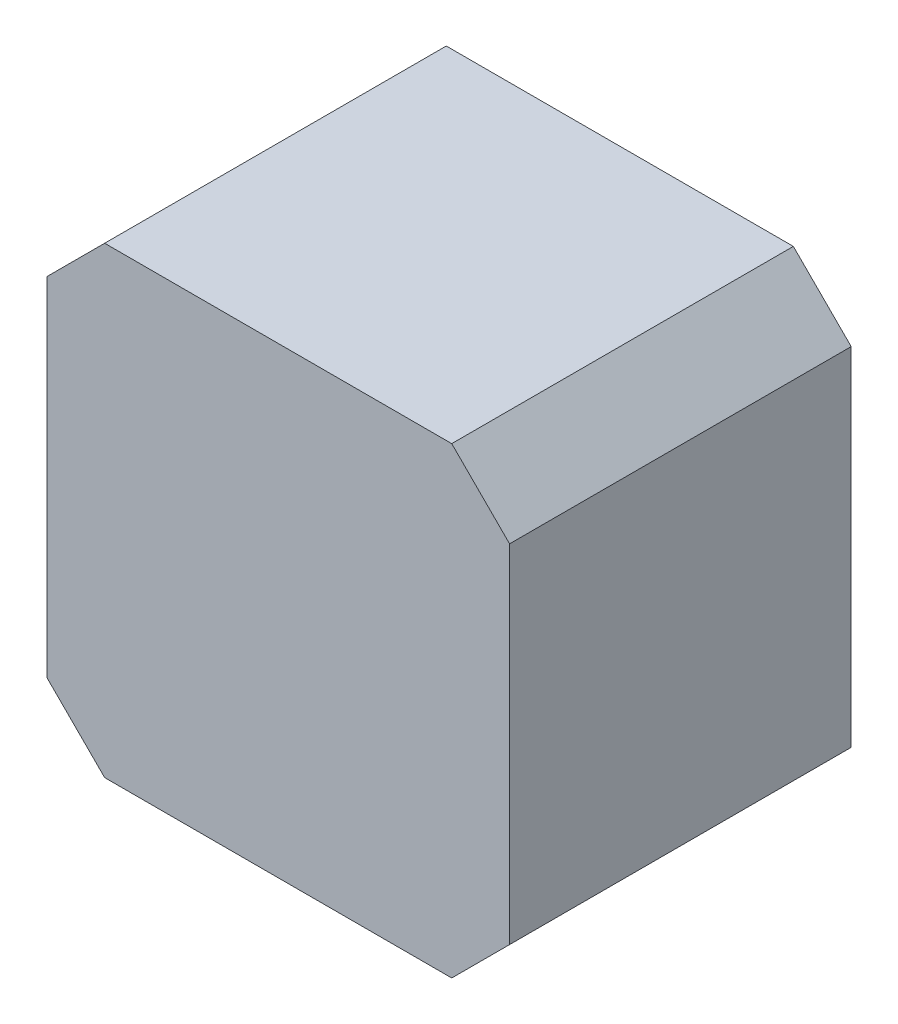
ISO-10303-21;
HEADER;
FILE_DESCRIPTION(('STEP AP214'),'2;1');
FILE_NAME('part.step','',(''),(''),'','','');
FILE_SCHEMA(('AUTOMOTIVE_DESIGN { 1 0 10303 214 1 1 1 1 }'));
ENDSEC;
DATA;
#1=APPLICATION_CONTEXT('core data for automotive mechanical design processes');
#2=APPLICATION_PROTOCOL_DEFINITION('international standard','automotive_design',2000,#1);
#3=PRODUCT_CONTEXT('',#1,'mechanical');
#4=PRODUCT('Part','Part','',(#3));
#5=PRODUCT_RELATED_PRODUCT_CATEGORY('part','',(#4));
#6=PRODUCT_DEFINITION_FORMATION('','',#4);
#7=PRODUCT_DEFINITION_CONTEXT('part definition',#1,'design');
#8=PRODUCT_DEFINITION('design','',#6,#7);
#9=PRODUCT_DEFINITION_SHAPE('','',#8);
#10=(LENGTH_UNIT() NAMED_UNIT(*) SI_UNIT(.MILLI.,.METRE.));
#11=(NAMED_UNIT(*) PLANE_ANGLE_UNIT() SI_UNIT($,.RADIAN.));
#12=(NAMED_UNIT(*) SI_UNIT($,.STERADIAN.) SOLID_ANGLE_UNIT());
#13=UNCERTAINTY_MEASURE_WITH_UNIT(LENGTH_MEASURE(1.E-05),#10,'distance_accuracy_value','');
#14=(GEOMETRIC_REPRESENTATION_CONTEXT(3) GLOBAL_UNCERTAINTY_ASSIGNED_CONTEXT((#13)) GLOBAL_UNIT_ASSIGNED_CONTEXT((#10,
#11,#12)) REPRESENTATION_CONTEXT('',''));
#15=CARTESIAN_POINT('',(0.,0.,0.));
#16=DIRECTION('',(0.,0.,1.));
#17=DIRECTION('',(1.,0.,0.));
#18=AXIS2_PLACEMENT_3D('',#15,#16,#17);
#19=CARTESIAN_POINT('',(1.016,-0.762,0.));
#20=DIRECTION('',(0.707106781186548,-0.707106781186548,0.));
#21=DIRECTION('',(0.707106781186548,0.707106781186548,0.));
#22=AXIS2_PLACEMENT_3D('',#19,#20,#21);
#23=PLANE('',#22);
#24=DIRECTION('',(0.,0.,-1.));
#25=VECTOR('',#24,1.);
#26=CARTESIAN_POINT('',(0.762,-1.016,0.));
#27=LINE('',#26,#25);
#28=CARTESIAN_POINT('',(0.762,-1.016,0.));
#29=VERTEX_POINT('',#28);
#30=CARTESIAN_POINT('',(0.762,-1.016,1.5));
#31=VERTEX_POINT('',#30);
#32=EDGE_CURVE('E86',#29,#31,#27,.F.);
#33=ORIENTED_EDGE('',*,*,#32,.F.);
#34=DIRECTION('',(0.707106781186548,0.707106781186548,0.));
#35=VECTOR('',#34,1.);
#36=CARTESIAN_POINT('',(1.016,-0.762,0.));
#37=LINE('',#36,#35);
#38=CARTESIAN_POINT('',(1.016,-0.762,0.));
#39=VERTEX_POINT('',#38);
#40=EDGE_CURVE('E20',#29,#39,#37,.T.);
#41=ORIENTED_EDGE('',*,*,#40,.T.);
#42=DIRECTION('',(0.,0.,-1.));
#43=VECTOR('',#42,1.);
#44=CARTESIAN_POINT('',(1.016,-0.762,0.));
#45=LINE('',#44,#43);
#46=CARTESIAN_POINT('',(1.016,-0.762,1.5));
#47=VERTEX_POINT('',#46);
#48=EDGE_CURVE('E99',#47,#39,#45,.T.);
#49=ORIENTED_EDGE('',*,*,#48,.F.);
#50=DIRECTION('',(0.707106781186547,0.707106781186548,0.));
#51=VECTOR('',#50,1.);
#52=CARTESIAN_POINT('',(0.762,-1.016,1.5));
#53=LINE('',#52,#51);
#54=EDGE_CURVE('E97',#31,#47,#53,.T.);
#55=ORIENTED_EDGE('',*,*,#54,.F.);
#56=EDGE_LOOP('',(#33,#41,#49,#55));
#57=FACE_BOUND('',#56,.T.);
#58=ADVANCED_FACE('F17',(#57),#23,.T.);
#59=CARTESIAN_POINT('',(0.762,1.016,0.));
#60=DIRECTION('',(0.707106781186548,0.707106781186548,0.));
#61=DIRECTION('',(-0.707106781186548,0.707106781186548,0.));
#62=AXIS2_PLACEMENT_3D('',#59,#60,#61);
#63=PLANE('',#62);
#64=DIRECTION('',(0.,0.,-1.));
#65=VECTOR('',#64,1.);
#66=CARTESIAN_POINT('',(1.016,0.762,0.));
#67=LINE('',#66,#65);
#68=CARTESIAN_POINT('',(1.016,0.762,0.));
#69=VERTEX_POINT('',#68);
#70=CARTESIAN_POINT('',(1.016,0.762,1.5));
#71=VERTEX_POINT('',#70);
#72=EDGE_CURVE('E108',#69,#71,#67,.F.);
#73=ORIENTED_EDGE('',*,*,#72,.F.);
#74=DIRECTION('',(-0.707106781186548,0.707106781186548,0.));
#75=VECTOR('',#74,1.);
#76=CARTESIAN_POINT('',(0.762,1.016,0.));
#77=LINE('',#76,#75);
#78=CARTESIAN_POINT('',(0.762,1.016,0.));
#79=VERTEX_POINT('',#78);
#80=EDGE_CURVE('E118',#69,#79,#77,.T.);
#81=ORIENTED_EDGE('',*,*,#80,.T.);
#82=DIRECTION('',(0.,0.,1.));
#83=VECTOR('',#82,1.);
#84=CARTESIAN_POINT('',(0.762,1.016,0.));
#85=LINE('',#84,#83);
#86=CARTESIAN_POINT('',(0.762,1.016,1.5));
#87=VERTEX_POINT('',#86);
#88=EDGE_CURVE('E145',#87,#79,#85,.F.);
#89=ORIENTED_EDGE('',*,*,#88,.F.);
#90=DIRECTION('',(-0.707106781186547,0.707106781186548,0.));
#91=VECTOR('',#90,1.);
#92=CARTESIAN_POINT('',(1.016,0.762,1.5));
#93=LINE('',#92,#91);
#94=EDGE_CURVE('E102',#71,#87,#93,.T.);
#95=ORIENTED_EDGE('',*,*,#94,.F.);
#96=EDGE_LOOP('',(#73,#81,#89,#95));
#97=FACE_BOUND('',#96,.T.);
#98=ADVANCED_FACE('F153',(#97),#63,.T.);
#99=CARTESIAN_POINT('',(-0.762,-1.016,0.));
#100=DIRECTION('',(-0.707106781186548,-0.707106781186548,0.));
#101=DIRECTION('',(0.707106781186548,-0.707106781186548,0.));
#102=AXIS2_PLACEMENT_3D('',#99,#100,#101);
#103=PLANE('',#102);
#104=DIRECTION('',(0.,0.,1.));
#105=VECTOR('',#104,1.);
#106=CARTESIAN_POINT('',(-1.016,-0.762,0.));
#107=LINE('',#106,#105);
#108=CARTESIAN_POINT('',(-1.016,-0.762,0.));
#109=VERTEX_POINT('',#108);
#110=CARTESIAN_POINT('',(-1.016,-0.762,1.5));
#111=VERTEX_POINT('',#110);
#112=EDGE_CURVE('E143',#109,#111,#107,.T.);
#113=ORIENTED_EDGE('',*,*,#112,.F.);
#114=DIRECTION('',(0.707106781186548,-0.707106781186548,0.));
#115=VECTOR('',#114,1.);
#116=CARTESIAN_POINT('',(-0.762,-1.016,0.));
#117=LINE('',#116,#115);
#118=CARTESIAN_POINT('',(-0.762,-1.016,0.));
#119=VERTEX_POINT('',#118);
#120=EDGE_CURVE('E117',#109,#119,#117,.T.);
#121=ORIENTED_EDGE('',*,*,#120,.T.);
#122=DIRECTION('',(0.,0.,-1.));
#123=VECTOR('',#122,1.);
#124=CARTESIAN_POINT('',(-0.762,-1.016,0.));
#125=LINE('',#124,#123);
#126=CARTESIAN_POINT('',(-0.762,-1.016,1.5));
#127=VERTEX_POINT('',#126);
#128=EDGE_CURVE('E106',#127,#119,#125,.T.);
#129=ORIENTED_EDGE('',*,*,#128,.F.);
#130=DIRECTION('',(0.707106781186548,-0.707106781186548,0.));
#131=VECTOR('',#130,1.);
#132=CARTESIAN_POINT('',(-1.016,-0.762,1.5));
#133=LINE('',#132,#131);
#134=EDGE_CURVE('E80',#111,#127,#133,.T.);
#135=ORIENTED_EDGE('',*,*,#134,.F.);
#136=EDGE_LOOP('',(#113,#121,#129,#135));
#137=FACE_BOUND('',#136,.T.);
#138=ADVANCED_FACE('F163',(#137),#103,.T.);
#139=CARTESIAN_POINT('',(-1.016,-0.762,1.5));
#140=DIRECTION('',(0.,0.,1.));
#141=DIRECTION('',(1.,0.,0.));
#142=AXIS2_PLACEMENT_3D('',#139,#140,#141);
#143=PLANE('',#142);
#144=DIRECTION('',(-0.707106781186548,-0.707106781186548,0.));
#145=VECTOR('',#144,1.);
#146=CARTESIAN_POINT('',(-1.016,0.762,1.5));
#147=LINE('',#146,#145);
#148=CARTESIAN_POINT('',(-1.016,0.762,1.5));
#149=VERTEX_POINT('',#148);
#150=CARTESIAN_POINT('',(-0.762,1.016,1.5));
#151=VERTEX_POINT('',#150);
#152=EDGE_CURVE('E113',#149,#151,#147,.F.);
#153=ORIENTED_EDGE('',*,*,#152,.F.);
#154=DIRECTION('',(0.,1.,0.));
#155=VECTOR('',#154,1.);
#156=CARTESIAN_POINT('',(-1.016,-0.762,1.5));
#157=LINE('',#156,#155);
#158=EDGE_CURVE('E141',#111,#149,#157,.T.);
#159=ORIENTED_EDGE('',*,*,#158,.F.);
#160=ORIENTED_EDGE('',*,*,#134,.T.);
#161=DIRECTION('',(1.,0.,0.));
#162=VECTOR('',#161,1.);
#163=CARTESIAN_POINT('',(0.762,-1.016,1.5));
#164=LINE('',#163,#162);
#165=EDGE_CURVE('E90',#31,#127,#164,.F.);
#166=ORIENTED_EDGE('',*,*,#165,.F.);
#167=ORIENTED_EDGE('',*,*,#54,.T.);
#168=DIRECTION('',(0.,1.,0.));
#169=VECTOR('',#168,1.);
#170=CARTESIAN_POINT('',(1.016,0.762,1.5));
#171=LINE('',#170,#169);
#172=EDGE_CURVE('E129',#71,#47,#171,.F.);
#173=ORIENTED_EDGE('',*,*,#172,.F.);
#174=ORIENTED_EDGE('',*,*,#94,.T.);
#175=DIRECTION('',(1.,0.,0.));
#176=VECTOR('',#175,1.);
#177=CARTESIAN_POINT('',(-0.762,1.016,1.5));
#178=LINE('',#177,#176);
#179=EDGE_CURVE('E147',#151,#87,#178,.T.);
#180=ORIENTED_EDGE('',*,*,#179,.F.);
#181=EDGE_LOOP('',(#153,#159,#160,#166,#167,#173,#174,#180));
#182=FACE_BOUND('',#181,.T.);
#183=ADVANCED_FACE('F105',(#182),#143,.T.);
#184=CARTESIAN_POINT('',(-1.016,0.762,0.));
#185=DIRECTION('',(-0.707106781186548,0.707106781186548,0.));
#186=DIRECTION('',(-0.707106781186548,-0.707106781186548,0.));
#187=AXIS2_PLACEMENT_3D('',#184,#185,#186);
#188=PLANE('',#187);
#189=DIRECTION('',(0.,0.,1.));
#190=VECTOR('',#189,1.);
#191=CARTESIAN_POINT('',(-0.762,1.016,0.));
#192=LINE('',#191,#190);
#193=CARTESIAN_POINT('',(-0.762,1.016,0.));
#194=VERTEX_POINT('',#193);
#195=EDGE_CURVE('E130',#194,#151,#192,.T.);
#196=ORIENTED_EDGE('',*,*,#195,.F.);
#197=DIRECTION('',(-0.707106781186548,-0.707106781186548,0.));
#198=VECTOR('',#197,1.);
#199=CARTESIAN_POINT('',(-1.016,0.762,0.));
#200=LINE('',#199,#198);
#201=CARTESIAN_POINT('',(-1.016,0.762,0.));
#202=VERTEX_POINT('',#201);
#203=EDGE_CURVE('E35',#194,#202,#200,.T.);
#204=ORIENTED_EDGE('',*,*,#203,.T.);
#205=DIRECTION('',(0.,0.,1.));
#206=VECTOR('',#205,1.);
#207=CARTESIAN_POINT('',(-1.016,0.762,0.));
#208=LINE('',#207,#206);
#209=EDGE_CURVE('E137',#149,#202,#208,.F.);
#210=ORIENTED_EDGE('',*,*,#209,.F.);
#211=ORIENTED_EDGE('',*,*,#152,.T.);
#212=EDGE_LOOP('',(#196,#204,#210,#211));
#213=FACE_BOUND('',#212,.T.);
#214=ADVANCED_FACE('F157',(#213),#188,.T.);
#215=CARTESIAN_POINT('',(0.762,-1.016,0.));
#216=DIRECTION('',(0.,-1.,0.));
#217=DIRECTION('',(0.,0.,-1.));
#218=AXIS2_PLACEMENT_3D('',#215,#216,#217);
#219=PLANE('',#218);
#220=ORIENTED_EDGE('',*,*,#128,.T.);
#221=DIRECTION('',(1.,0.,0.));
#222=VECTOR('',#221,1.);
#223=CARTESIAN_POINT('',(-1.016,-1.016,0.));
#224=LINE('',#223,#222);
#225=EDGE_CURVE('E93',#119,#29,#224,.T.);
#226=ORIENTED_EDGE('',*,*,#225,.T.);
#227=ORIENTED_EDGE('',*,*,#32,.T.);
#228=ORIENTED_EDGE('',*,*,#165,.T.);
#229=EDGE_LOOP('',(#220,#226,#227,#228));
#230=FACE_BOUND('',#229,.T.);
#231=ADVANCED_FACE('F89',(#230),#219,.T.);
#232=CARTESIAN_POINT('',(1.016,0.762,0.));
#233=DIRECTION('',(1.,0.,0.));
#234=DIRECTION('',(0.,0.,-1.));
#235=AXIS2_PLACEMENT_3D('',#232,#233,#234);
#236=PLANE('',#235);
#237=ORIENTED_EDGE('',*,*,#48,.T.);
#238=DIRECTION('',(0.,1.,0.));
#239=VECTOR('',#238,1.);
#240=CARTESIAN_POINT('',(1.016,-0.762,0.));
#241=LINE('',#240,#239);
#242=EDGE_CURVE('E128',#39,#69,#241,.T.);
#243=ORIENTED_EDGE('',*,*,#242,.T.);
#244=ORIENTED_EDGE('',*,*,#72,.T.);
#245=ORIENTED_EDGE('',*,*,#172,.T.);
#246=EDGE_LOOP('',(#237,#243,#244,#245));
#247=FACE_BOUND('',#246,.T.);
#248=ADVANCED_FACE('F127',(#247),#236,.T.);
#249=CARTESIAN_POINT('',(-0.762,1.016,0.));
#250=DIRECTION('',(0.,1.,0.));
#251=DIRECTION('',(0.,0.,1.));
#252=AXIS2_PLACEMENT_3D('',#249,#250,#251);
#253=PLANE('',#252);
#254=ORIENTED_EDGE('',*,*,#88,.T.);
#255=DIRECTION('',(1.,0.,0.));
#256=VECTOR('',#255,1.);
#257=CARTESIAN_POINT('',(-1.016,1.016,0.));
#258=LINE('',#257,#256);
#259=EDGE_CURVE('E26',#79,#194,#258,.F.);
#260=ORIENTED_EDGE('',*,*,#259,.T.);
#261=ORIENTED_EDGE('',*,*,#195,.T.);
#262=ORIENTED_EDGE('',*,*,#179,.T.);
#263=EDGE_LOOP('',(#254,#260,#261,#262));
#264=FACE_BOUND('',#263,.T.);
#265=ADVANCED_FACE('F156',(#264),#253,.T.);
#266=CARTESIAN_POINT('',(-1.016,-0.762,0.));
#267=DIRECTION('',(-1.,0.,0.));
#268=DIRECTION('',(0.,0.,1.));
#269=AXIS2_PLACEMENT_3D('',#266,#267,#268);
#270=PLANE('',#269);
#271=ORIENTED_EDGE('',*,*,#209,.T.);
#272=DIRECTION('',(0.,1.,0.));
#273=VECTOR('',#272,1.);
#274=CARTESIAN_POINT('',(-1.016,-0.762,0.));
#275=LINE('',#274,#273);
#276=EDGE_CURVE('E11',#202,#109,#275,.F.);
#277=ORIENTED_EDGE('',*,*,#276,.T.);
#278=ORIENTED_EDGE('',*,*,#112,.T.);
#279=ORIENTED_EDGE('',*,*,#158,.T.);
#280=EDGE_LOOP('',(#271,#277,#278,#279));
#281=FACE_BOUND('',#280,.T.);
#282=ADVANCED_FACE('F159',(#281),#270,.T.);
#283=CARTESIAN_POINT('',(-1.016,-0.762,0.));
#284=DIRECTION('',(0.,0.,1.));
#285=DIRECTION('',(1.,0.,0.));
#286=AXIS2_PLACEMENT_3D('',#283,#284,#285);
#287=PLANE('',#286);
#288=ORIENTED_EDGE('',*,*,#203,.F.);
#289=ORIENTED_EDGE('',*,*,#259,.F.);
#290=ORIENTED_EDGE('',*,*,#80,.F.);
#291=ORIENTED_EDGE('',*,*,#242,.F.);
#292=ORIENTED_EDGE('',*,*,#40,.F.);
#293=ORIENTED_EDGE('',*,*,#225,.F.);
#294=ORIENTED_EDGE('',*,*,#120,.F.);
#295=ORIENTED_EDGE('',*,*,#276,.F.);
#296=EDGE_LOOP('',(#288,#289,#290,#291,#292,#293,#294,#295));
#297=FACE_BOUND('',#296,.T.);
#298=ADVANCED_FACE('F132',(#297),#287,.F.);
#299=CLOSED_SHELL('',(#58,#98,#138,#183,#214,#231,#248,#265,#282,#298));
#300=MANIFOLD_SOLID_BREP('B1',#299);
#301=ADVANCED_BREP_SHAPE_REPRESENTATION('',(#18,#300),#14);
#302=SHAPE_DEFINITION_REPRESENTATION(#9,#301);
ENDSEC;
END-ISO-10303-21;
